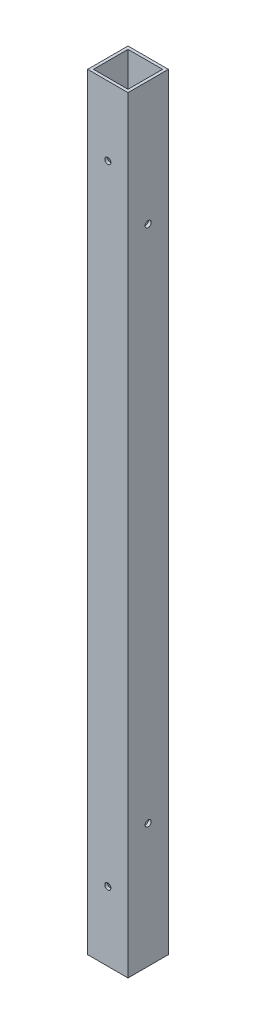
ISO-10303-21;
HEADER;
FILE_DESCRIPTION(('STEP AP214'),'2;1');
FILE_NAME('part.step','',(''),(''),'','','');
FILE_SCHEMA(('AUTOMOTIVE_DESIGN { 1 0 10303 214 1 1 1 1 }'));
ENDSEC;
DATA;
#1=APPLICATION_CONTEXT('core data for automotive mechanical design processes');
#2=APPLICATION_PROTOCOL_DEFINITION('international standard','automotive_design',2000,#1);
#3=PRODUCT_CONTEXT('',#1,'mechanical');
#4=PRODUCT('Part','Part','',(#3));
#5=PRODUCT_RELATED_PRODUCT_CATEGORY('part','',(#4));
#6=PRODUCT_DEFINITION_FORMATION('','',#4);
#7=PRODUCT_DEFINITION_CONTEXT('part definition',#1,'design');
#8=PRODUCT_DEFINITION('design','',#6,#7);
#9=PRODUCT_DEFINITION_SHAPE('','',#8);
#10=(LENGTH_UNIT() NAMED_UNIT(*) SI_UNIT(.MILLI.,.METRE.));
#11=(NAMED_UNIT(*) PLANE_ANGLE_UNIT() SI_UNIT($,.RADIAN.));
#12=(NAMED_UNIT(*) SI_UNIT($,.STERADIAN.) SOLID_ANGLE_UNIT());
#13=UNCERTAINTY_MEASURE_WITH_UNIT(LENGTH_MEASURE(1.E-05),#10,'distance_accuracy_value','');
#14=(GEOMETRIC_REPRESENTATION_CONTEXT(3) GLOBAL_UNCERTAINTY_ASSIGNED_CONTEXT((#13)) GLOBAL_UNIT_ASSIGNED_CONTEXT((#10,
#11,#12)) REPRESENTATION_CONTEXT('',''));
#15=CARTESIAN_POINT('',(0.,0.,0.));
#16=DIRECTION('',(0.,0.,1.));
#17=DIRECTION('',(1.,0.,0.));
#18=AXIS2_PLACEMENT_3D('',#15,#16,#17);
#19=CARTESIAN_POINT('',(0.,844.55,0.));
#20=DIRECTION('',(0.,-1.,0.));
#21=DIRECTION('',(0.,0.,-1.));
#22=AXIS2_PLACEMENT_3D('',#19,#20,#21);
#23=PLANE('',#22);
#24=DIRECTION('',(0.,0.,-1.));
#25=VECTOR('',#24,1.);
#26=CARTESIAN_POINT('',(22.2249999999999,844.55,22.225));
#27=LINE('',#26,#25);
#28=CARTESIAN_POINT('',(22.2249999999999,844.55,22.225));
#29=VERTEX_POINT('',#28);
#30=CARTESIAN_POINT('',(22.2249999999999,844.55,-22.225));
#31=VERTEX_POINT('',#30);
#32=EDGE_CURVE('E178',#29,#31,#27,.T.);
#33=ORIENTED_EDGE('',*,*,#32,.T.);
#34=DIRECTION('',(-1.,0.,0.));
#35=VECTOR('',#34,1.);
#36=CARTESIAN_POINT('',(-22.2249999999999,844.55,-22.225));
#37=LINE('',#36,#35);
#38=CARTESIAN_POINT('',(-22.2249999999999,844.55,-22.225));
#39=VERTEX_POINT('',#38);
#40=EDGE_CURVE('E182',#31,#39,#37,.T.);
#41=ORIENTED_EDGE('',*,*,#40,.T.);
#42=DIRECTION('',(0.,0.,1.));
#43=VECTOR('',#42,1.);
#44=CARTESIAN_POINT('',(-22.2249999999999,844.55,22.225));
#45=LINE('',#44,#43);
#46=CARTESIAN_POINT('',(-22.2249999999999,844.55,22.225));
#47=VERTEX_POINT('',#46);
#48=EDGE_CURVE('E185',#39,#47,#45,.T.);
#49=ORIENTED_EDGE('',*,*,#48,.T.);
#50=DIRECTION('',(1.,0.,0.));
#51=VECTOR('',#50,1.);
#52=CARTESIAN_POINT('',(-22.2249999999999,844.55,22.225));
#53=LINE('',#52,#51);
#54=EDGE_CURVE('E188',#47,#29,#53,.T.);
#55=ORIENTED_EDGE('',*,*,#54,.T.);
#56=EDGE_LOOP('',(#33,#41,#49,#55));
#57=FACE_BOUND('',#56,.T.);
#58=DIRECTION('',(0.,0.,-1.));
#59=VECTOR('',#58,1.);
#60=CARTESIAN_POINT('',(19.05,844.55,19.05));
#61=LINE('',#60,#59);
#62=CARTESIAN_POINT('',(19.05,844.55,19.05));
#63=VERTEX_POINT('',#62);
#64=CARTESIAN_POINT('',(19.05,844.55,-19.05));
#65=VERTEX_POINT('',#64);
#66=EDGE_CURVE('E126',#63,#65,#61,.T.);
#67=ORIENTED_EDGE('',*,*,#66,.F.);
#68=DIRECTION('',(1.,0.,0.));
#69=VECTOR('',#68,1.);
#70=CARTESIAN_POINT('',(-19.05,844.55,19.05));
#71=LINE('',#70,#69);
#72=CARTESIAN_POINT('',(-19.05,844.55,19.05));
#73=VERTEX_POINT('',#72);
#74=EDGE_CURVE('E154',#73,#63,#71,.T.);
#75=ORIENTED_EDGE('',*,*,#74,.F.);
#76=DIRECTION('',(0.,0.,1.));
#77=VECTOR('',#76,1.);
#78=CARTESIAN_POINT('',(-19.05,844.55,19.05));
#79=LINE('',#78,#77);
#80=CARTESIAN_POINT('',(-19.05,844.55,-19.05));
#81=VERTEX_POINT('',#80);
#82=EDGE_CURVE('E148',#81,#73,#79,.T.);
#83=ORIENTED_EDGE('',*,*,#82,.F.);
#84=DIRECTION('',(-1.,0.,0.));
#85=VECTOR('',#84,1.);
#86=CARTESIAN_POINT('',(-19.05,844.55,-19.05));
#87=LINE('',#86,#85);
#88=EDGE_CURVE('E135',#65,#81,#87,.T.);
#89=ORIENTED_EDGE('',*,*,#88,.F.);
#90=EDGE_LOOP('',(#67,#75,#83,#89));
#91=FACE_BOUND('',#90,.T.);
#92=ADVANCED_FACE('F42',(#57,#91),#23,.F.);
#93=CARTESIAN_POINT('',(0.,0.,0.));
#94=DIRECTION('',(0.,-1.,0.));
#95=DIRECTION('',(0.,0.,-1.));
#96=AXIS2_PLACEMENT_3D('',#93,#94,#95);
#97=PLANE('',#96);
#98=DIRECTION('',(0.,0.,-1.));
#99=VECTOR('',#98,1.);
#100=CARTESIAN_POINT('',(22.2249999999999,0.,22.225));
#101=LINE('',#100,#99);
#102=CARTESIAN_POINT('',(22.2249999999999,0.,22.225));
#103=VERTEX_POINT('',#102);
#104=CARTESIAN_POINT('',(22.2249999999999,0.,-22.225));
#105=VERTEX_POINT('',#104);
#106=EDGE_CURVE('E144',#103,#105,#101,.T.);
#107=ORIENTED_EDGE('',*,*,#106,.F.);
#108=DIRECTION('',(1.,0.,0.));
#109=VECTOR('',#108,1.);
#110=CARTESIAN_POINT('',(-22.2249999999999,0.,22.225));
#111=LINE('',#110,#109);
#112=CARTESIAN_POINT('',(-22.2249999999999,0.,22.225));
#113=VERTEX_POINT('',#112);
#114=EDGE_CURVE('E183',#113,#103,#111,.T.);
#115=ORIENTED_EDGE('',*,*,#114,.F.);
#116=DIRECTION('',(0.,0.,1.));
#117=VECTOR('',#116,1.);
#118=CARTESIAN_POINT('',(-22.2249999999999,0.,22.225));
#119=LINE('',#118,#117);
#120=CARTESIAN_POINT('',(-22.2249999999999,0.,-22.225));
#121=VERTEX_POINT('',#120);
#122=EDGE_CURVE('E198',#121,#113,#119,.T.);
#123=ORIENTED_EDGE('',*,*,#122,.F.);
#124=DIRECTION('',(-1.,0.,0.));
#125=VECTOR('',#124,1.);
#126=CARTESIAN_POINT('',(-22.2249999999999,0.,-22.225));
#127=LINE('',#126,#125);
#128=EDGE_CURVE('E195',#105,#121,#127,.T.);
#129=ORIENTED_EDGE('',*,*,#128,.F.);
#130=EDGE_LOOP('',(#107,#115,#123,#129));
#131=FACE_BOUND('',#130,.T.);
#132=DIRECTION('',(1.,0.,0.));
#133=VECTOR('',#132,1.);
#134=CARTESIAN_POINT('',(-19.05,0.,19.05));
#135=LINE('',#134,#133);
#136=CARTESIAN_POINT('',(-19.05,0.,19.05));
#137=VERTEX_POINT('',#136);
#138=CARTESIAN_POINT('',(19.05,0.,19.05));
#139=VERTEX_POINT('',#138);
#140=EDGE_CURVE('E136',#137,#139,#135,.T.);
#141=ORIENTED_EDGE('',*,*,#140,.T.);
#142=DIRECTION('',(0.,0.,-1.));
#143=VECTOR('',#142,1.);
#144=CARTESIAN_POINT('',(19.05,0.,19.05));
#145=LINE('',#144,#143);
#146=CARTESIAN_POINT('',(19.05,0.,-19.05));
#147=VERTEX_POINT('',#146);
#148=EDGE_CURVE('E74',#139,#147,#145,.T.);
#149=ORIENTED_EDGE('',*,*,#148,.T.);
#150=DIRECTION('',(-1.,0.,0.));
#151=VECTOR('',#150,1.);
#152=CARTESIAN_POINT('',(-19.05,0.,-19.05));
#153=LINE('',#152,#151);
#154=CARTESIAN_POINT('',(-19.05,0.,-19.05));
#155=VERTEX_POINT('',#154);
#156=EDGE_CURVE('E142',#147,#155,#153,.T.);
#157=ORIENTED_EDGE('',*,*,#156,.T.);
#158=DIRECTION('',(0.,0.,1.));
#159=VECTOR('',#158,1.);
#160=CARTESIAN_POINT('',(-19.05,0.,19.05));
#161=LINE('',#160,#159);
#162=EDGE_CURVE('E165',#155,#137,#161,.T.);
#163=ORIENTED_EDGE('',*,*,#162,.T.);
#164=EDGE_LOOP('',(#141,#149,#157,#163));
#165=FACE_BOUND('',#164,.T.);
#166=ADVANCED_FACE('F290',(#131,#165),#97,.T.);
#167=CARTESIAN_POINT('',(22.2249999999999,844.55,22.225));
#168=DIRECTION('',(-1.,0.,0.));
#169=DIRECTION('',(0.,0.,1.));
#170=AXIS2_PLACEMENT_3D('',#167,#168,#169);
#171=PLANE('',#170);
#172=CARTESIAN_POINT('',(22.2249999999999,136.524999999995,0.));
#173=DIRECTION('',(1.,0.,0.));
#174=DIRECTION('',(0.,0.,-1.));
#175=AXIS2_PLACEMENT_3D('',#172,#173,#174);
#176=CIRCLE('',#175,3.37343750000776);
#177=CARTESIAN_POINT('',(22.2249999999999,136.524999999995,-3.37343750000774));
#178=VERTEX_POINT('',#177);
#179=EDGE_CURVE('E237',#178,#178,#176,.T.);
#180=ORIENTED_EDGE('',*,*,#179,.F.);
#181=EDGE_LOOP('',(#180));
#182=FACE_BOUND('',#181,.T.);
#183=CARTESIAN_POINT('',(22.2249999999999,708.025000000005,0.));
#184=DIRECTION('',(1.,0.,0.));
#185=DIRECTION('',(0.,0.,-1.));
#186=AXIS2_PLACEMENT_3D('',#183,#184,#185);
#187=CIRCLE('',#186,3.37343749999222);
#188=CARTESIAN_POINT('',(22.2249999999999,708.025000000005,-3.3734374999922));
#189=VERTEX_POINT('',#188);
#190=EDGE_CURVE('E251',#189,#189,#187,.T.);
#191=ORIENTED_EDGE('',*,*,#190,.F.);
#192=EDGE_LOOP('',(#191));
#193=FACE_BOUND('',#192,.T.);
#194=ORIENTED_EDGE('',*,*,#106,.T.);
#195=DIRECTION('',(0.,-1.,0.));
#196=VECTOR('',#195,1.);
#197=CARTESIAN_POINT('',(22.2249999999999,844.55,-22.225));
#198=LINE('',#197,#196);
#199=EDGE_CURVE('E11',#31,#105,#198,.T.);
#200=ORIENTED_EDGE('',*,*,#199,.F.);
#201=ORIENTED_EDGE('',*,*,#32,.F.);
#202=DIRECTION('',(0.,-1.,0.));
#203=VECTOR('',#202,1.);
#204=CARTESIAN_POINT('',(22.2249999999999,844.55,22.225));
#205=LINE('',#204,#203);
#206=EDGE_CURVE('E191',#29,#103,#205,.T.);
#207=ORIENTED_EDGE('',*,*,#206,.T.);
#208=EDGE_LOOP('',(#194,#200,#201,#207));
#209=FACE_BOUND('',#208,.T.);
#210=ADVANCED_FACE('F44',(#182,#193,#209),#171,.F.);
#211=CARTESIAN_POINT('',(-22.2249999999999,844.55,-22.225));
#212=DIRECTION('',(0.,0.,1.));
#213=DIRECTION('',(1.,0.,0.));
#214=AXIS2_PLACEMENT_3D('',#211,#212,#213);
#215=PLANE('',#214);
#216=CARTESIAN_POINT('',(0.,768.35,-22.225));
#217=DIRECTION('',(0.,0.,1.));
#218=DIRECTION('',(1.,0.,0.));
#219=AXIS2_PLACEMENT_3D('',#216,#217,#218);
#220=CIRCLE('',#219,3.37350099999999);
#221=CARTESIAN_POINT('',(3.37350099999999,768.35,-22.225));
#222=VERTEX_POINT('',#221);
#223=EDGE_CURVE('E222',#222,#222,#220,.T.);
#224=ORIENTED_EDGE('',*,*,#223,.T.);
#225=EDGE_LOOP('',(#224));
#226=FACE_BOUND('',#225,.T.);
#227=CARTESIAN_POINT('',(0.,76.2,-22.225));
#228=DIRECTION('',(0.,0.,1.));
#229=DIRECTION('',(1.,0.,0.));
#230=AXIS2_PLACEMENT_3D('',#227,#228,#229);
#231=CIRCLE('',#230,3.37350099999999);
#232=CARTESIAN_POINT('',(3.37350099999999,76.2,-22.225));
#233=VERTEX_POINT('',#232);
#234=EDGE_CURVE('E217',#233,#233,#231,.T.);
#235=ORIENTED_EDGE('',*,*,#234,.T.);
#236=EDGE_LOOP('',(#235));
#237=FACE_BOUND('',#236,.T.);
#238=ORIENTED_EDGE('',*,*,#128,.T.);
#239=DIRECTION('',(0.,-1.,0.));
#240=VECTOR('',#239,1.);
#241=CARTESIAN_POINT('',(-22.2249999999999,844.55,-22.225));
#242=LINE('',#241,#240);
#243=EDGE_CURVE('E52',#39,#121,#242,.T.);
#244=ORIENTED_EDGE('',*,*,#243,.F.);
#245=ORIENTED_EDGE('',*,*,#40,.F.);
#246=ORIENTED_EDGE('',*,*,#199,.T.);
#247=EDGE_LOOP('',(#238,#244,#245,#246));
#248=FACE_BOUND('',#247,.T.);
#249=ADVANCED_FACE('F318',(#226,#237,#248),#215,.F.);
#250=CARTESIAN_POINT('',(-22.2249999999999,844.55,22.225));
#251=DIRECTION('',(1.,0.,0.));
#252=DIRECTION('',(0.,0.,-1.));
#253=AXIS2_PLACEMENT_3D('',#250,#251,#252);
#254=PLANE('',#253);
#255=CARTESIAN_POINT('',(-22.2249999999999,136.524999999995,0.));
#256=DIRECTION('',(1.,0.,0.));
#257=DIRECTION('',(0.,0.,-1.));
#258=AXIS2_PLACEMENT_3D('',#255,#256,#257);
#259=CIRCLE('',#258,3.37343750000776);
#260=CARTESIAN_POINT('',(-22.2249999999999,136.524999999995,-3.37343750000774));
#261=VERTEX_POINT('',#260);
#262=EDGE_CURVE('E227',#261,#261,#259,.T.);
#263=ORIENTED_EDGE('',*,*,#262,.T.);
#264=EDGE_LOOP('',(#263));
#265=FACE_BOUND('',#264,.T.);
#266=CARTESIAN_POINT('',(-22.2249999999999,708.025000000005,0.));
#267=DIRECTION('',(1.,0.,0.));
#268=DIRECTION('',(0.,0.,-1.));
#269=AXIS2_PLACEMENT_3D('',#266,#267,#268);
#270=CIRCLE('',#269,3.37343749999222);
#271=CARTESIAN_POINT('',(-22.2249999999999,708.025000000005,-3.3734374999922));
#272=VERTEX_POINT('',#271);
#273=EDGE_CURVE('E246',#272,#272,#270,.T.);
#274=ORIENTED_EDGE('',*,*,#273,.T.);
#275=EDGE_LOOP('',(#274));
#276=FACE_BOUND('',#275,.T.);
#277=ORIENTED_EDGE('',*,*,#122,.T.);
#278=DIRECTION('',(0.,-1.,0.));
#279=VECTOR('',#278,1.);
#280=CARTESIAN_POINT('',(-22.2249999999999,844.55,22.225));
#281=LINE('',#280,#279);
#282=EDGE_CURVE('E206',#47,#113,#281,.T.);
#283=ORIENTED_EDGE('',*,*,#282,.F.);
#284=ORIENTED_EDGE('',*,*,#48,.F.);
#285=ORIENTED_EDGE('',*,*,#243,.T.);
#286=EDGE_LOOP('',(#277,#283,#284,#285));
#287=FACE_BOUND('',#286,.T.);
#288=ADVANCED_FACE('F315',(#265,#276,#287),#254,.F.);
#289=CARTESIAN_POINT('',(-22.2249999999999,844.55,22.225));
#290=DIRECTION('',(0.,0.,-1.));
#291=DIRECTION('',(-1.,0.,0.));
#292=AXIS2_PLACEMENT_3D('',#289,#290,#291);
#293=PLANE('',#292);
#294=CARTESIAN_POINT('',(0.,768.35,22.225));
#295=DIRECTION('',(0.,0.,1.));
#296=DIRECTION('',(1.,0.,0.));
#297=AXIS2_PLACEMENT_3D('',#294,#295,#296);
#298=CIRCLE('',#297,3.37350099999999);
#299=CARTESIAN_POINT('',(3.37350099999999,768.35,22.225));
#300=VERTEX_POINT('',#299);
#301=EDGE_CURVE('E259',#300,#300,#298,.T.);
#302=ORIENTED_EDGE('',*,*,#301,.F.);
#303=EDGE_LOOP('',(#302));
#304=FACE_BOUND('',#303,.T.);
#305=CARTESIAN_POINT('',(0.,76.2,22.225));
#306=DIRECTION('',(0.,0.,1.));
#307=DIRECTION('',(1.,0.,0.));
#308=AXIS2_PLACEMENT_3D('',#305,#306,#307);
#309=CIRCLE('',#308,3.37350099999999);
#310=CARTESIAN_POINT('',(3.37350099999999,76.2,22.225));
#311=VERTEX_POINT('',#310);
#312=EDGE_CURVE('E269',#311,#311,#309,.T.);
#313=ORIENTED_EDGE('',*,*,#312,.F.);
#314=EDGE_LOOP('',(#313));
#315=FACE_BOUND('',#314,.T.);
#316=ORIENTED_EDGE('',*,*,#114,.T.);
#317=ORIENTED_EDGE('',*,*,#206,.F.);
#318=ORIENTED_EDGE('',*,*,#54,.F.);
#319=ORIENTED_EDGE('',*,*,#282,.T.);
#320=EDGE_LOOP('',(#316,#317,#318,#319));
#321=FACE_BOUND('',#320,.T.);
#322=ADVANCED_FACE('F312',(#304,#315,#321),#293,.F.);
#323=CARTESIAN_POINT('',(19.05,844.55,19.05));
#324=DIRECTION('',(-1.,0.,0.));
#325=DIRECTION('',(0.,0.,1.));
#326=AXIS2_PLACEMENT_3D('',#323,#324,#325);
#327=PLANE('',#326);
#328=CARTESIAN_POINT('',(19.05,136.524999999995,0.));
#329=DIRECTION('',(-1.,0.,0.));
#330=DIRECTION('',(0.,0.,1.));
#331=AXIS2_PLACEMENT_3D('',#328,#329,#330);
#332=CIRCLE('',#331,3.37343750000776);
#333=CARTESIAN_POINT('',(19.05,136.524999999995,3.37343750000778));
#334=VERTEX_POINT('',#333);
#335=EDGE_CURVE('E255',#334,#334,#332,.T.);
#336=ORIENTED_EDGE('',*,*,#335,.F.);
#337=EDGE_LOOP('',(#336));
#338=FACE_BOUND('',#337,.T.);
#339=CARTESIAN_POINT('',(19.05,708.025000000005,0.));
#340=DIRECTION('',(-1.,0.,0.));
#341=DIRECTION('',(0.,0.,1.));
#342=AXIS2_PLACEMENT_3D('',#339,#340,#341);
#343=CIRCLE('',#342,3.37343749999222);
#344=CARTESIAN_POINT('',(19.05,708.025000000005,3.37343749999224));
#345=VERTEX_POINT('',#344);
#346=EDGE_CURVE('E226',#345,#345,#343,.T.);
#347=ORIENTED_EDGE('',*,*,#346,.F.);
#348=EDGE_LOOP('',(#347));
#349=FACE_BOUND('',#348,.T.);
#350=ORIENTED_EDGE('',*,*,#148,.F.);
#351=DIRECTION('',(0.,-1.,0.));
#352=VECTOR('',#351,1.);
#353=CARTESIAN_POINT('',(19.05,844.55,19.05));
#354=LINE('',#353,#352);
#355=EDGE_CURVE('E130',#63,#139,#354,.T.);
#356=ORIENTED_EDGE('',*,*,#355,.F.);
#357=ORIENTED_EDGE('',*,*,#66,.T.);
#358=DIRECTION('',(0.,-1.,0.));
#359=VECTOR('',#358,1.);
#360=CARTESIAN_POINT('',(19.05,844.55,-19.05));
#361=LINE('',#360,#359);
#362=EDGE_CURVE('E129',#65,#147,#361,.T.);
#363=ORIENTED_EDGE('',*,*,#362,.T.);
#364=EDGE_LOOP('',(#350,#356,#357,#363));
#365=FACE_BOUND('',#364,.T.);
#366=ADVANCED_FACE('F128',(#338,#349,#365),#327,.T.);
#367=CARTESIAN_POINT('',(-19.05,844.55,-19.05));
#368=DIRECTION('',(0.,0.,1.));
#369=DIRECTION('',(1.,0.,0.));
#370=AXIS2_PLACEMENT_3D('',#367,#368,#369);
#371=PLANE('',#370);
#372=CARTESIAN_POINT('',(0.,768.35,-19.05));
#373=DIRECTION('',(0.,0.,1.));
#374=DIRECTION('',(1.,0.,0.));
#375=AXIS2_PLACEMENT_3D('',#372,#373,#374);
#376=CIRCLE('',#375,3.37350099999999);
#377=CARTESIAN_POINT('',(3.37350099999999,768.35,-19.05));
#378=VERTEX_POINT('',#377);
#379=EDGE_CURVE('E218',#378,#378,#376,.T.);
#380=ORIENTED_EDGE('',*,*,#379,.F.);
#381=EDGE_LOOP('',(#380));
#382=FACE_BOUND('',#381,.T.);
#383=CARTESIAN_POINT('',(0.,76.2,-19.05));
#384=DIRECTION('',(0.,0.,1.));
#385=DIRECTION('',(1.,0.,0.));
#386=AXIS2_PLACEMENT_3D('',#383,#384,#385);
#387=CIRCLE('',#386,3.37350099999999);
#388=CARTESIAN_POINT('',(3.37350099999999,76.2,-19.05));
#389=VERTEX_POINT('',#388);
#390=EDGE_CURVE('E213',#389,#389,#387,.T.);
#391=ORIENTED_EDGE('',*,*,#390,.F.);
#392=EDGE_LOOP('',(#391));
#393=FACE_BOUND('',#392,.T.);
#394=ORIENTED_EDGE('',*,*,#156,.F.);
#395=ORIENTED_EDGE('',*,*,#362,.F.);
#396=ORIENTED_EDGE('',*,*,#88,.T.);
#397=DIRECTION('',(0.,-1.,0.));
#398=VECTOR('',#397,1.);
#399=CARTESIAN_POINT('',(-19.05,844.55,-19.05));
#400=LINE('',#399,#398);
#401=EDGE_CURVE('E145',#81,#155,#400,.T.);
#402=ORIENTED_EDGE('',*,*,#401,.T.);
#403=EDGE_LOOP('',(#394,#395,#396,#402));
#404=FACE_BOUND('',#403,.T.);
#405=ADVANCED_FACE('F139',(#382,#393,#404),#371,.T.);
#406=CARTESIAN_POINT('',(-19.05,844.55,19.05));
#407=DIRECTION('',(1.,0.,0.));
#408=DIRECTION('',(0.,0.,-1.));
#409=AXIS2_PLACEMENT_3D('',#406,#407,#408);
#410=PLANE('',#409);
#411=CARTESIAN_POINT('',(-19.05,136.524999999995,0.));
#412=DIRECTION('',(1.,0.,0.));
#413=DIRECTION('',(0.,0.,-1.));
#414=AXIS2_PLACEMENT_3D('',#411,#412,#413);
#415=CIRCLE('',#414,3.37343750000776);
#416=CARTESIAN_POINT('',(-19.05,136.524999999995,-3.37343750000774));
#417=VERTEX_POINT('',#416);
#418=EDGE_CURVE('E46',#417,#417,#415,.T.);
#419=ORIENTED_EDGE('',*,*,#418,.F.);
#420=EDGE_LOOP('',(#419));
#421=FACE_BOUND('',#420,.T.);
#422=CARTESIAN_POINT('',(-19.05,708.025000000005,0.));
#423=DIRECTION('',(1.,0.,0.));
#424=DIRECTION('',(0.,0.,-1.));
#425=AXIS2_PLACEMENT_3D('',#422,#423,#424);
#426=CIRCLE('',#425,3.37343749999222);
#427=CARTESIAN_POINT('',(-19.05,708.025000000005,-3.3734374999922));
#428=VERTEX_POINT('',#427);
#429=EDGE_CURVE('E223',#428,#428,#426,.T.);
#430=ORIENTED_EDGE('',*,*,#429,.F.);
#431=EDGE_LOOP('',(#430));
#432=FACE_BOUND('',#431,.T.);
#433=ORIENTED_EDGE('',*,*,#162,.F.);
#434=ORIENTED_EDGE('',*,*,#401,.F.);
#435=ORIENTED_EDGE('',*,*,#82,.T.);
#436=DIRECTION('',(0.,-1.,0.));
#437=VECTOR('',#436,1.);
#438=CARTESIAN_POINT('',(-19.05,844.55,19.05));
#439=LINE('',#438,#437);
#440=EDGE_CURVE('E63',#73,#137,#439,.T.);
#441=ORIENTED_EDGE('',*,*,#440,.T.);
#442=EDGE_LOOP('',(#433,#434,#435,#441));
#443=FACE_BOUND('',#442,.T.);
#444=ADVANCED_FACE('F285',(#421,#432,#443),#410,.T.);
#445=CARTESIAN_POINT('',(-19.05,844.55,19.05));
#446=DIRECTION('',(0.,0.,-1.));
#447=DIRECTION('',(-1.,0.,0.));
#448=AXIS2_PLACEMENT_3D('',#445,#446,#447);
#449=PLANE('',#448);
#450=CARTESIAN_POINT('',(0.,768.35,19.05));
#451=DIRECTION('',(0.,0.,-1.));
#452=DIRECTION('',(-1.,0.,0.));
#453=AXIS2_PLACEMENT_3D('',#450,#451,#452);
#454=CIRCLE('',#453,3.37350099999999);
#455=CARTESIAN_POINT('',(-3.37350099999999,768.35,19.05));
#456=VERTEX_POINT('',#455);
#457=EDGE_CURVE('E221',#456,#456,#454,.T.);
#458=ORIENTED_EDGE('',*,*,#457,.F.);
#459=EDGE_LOOP('',(#458));
#460=FACE_BOUND('',#459,.T.);
#461=CARTESIAN_POINT('',(0.,76.2,19.05));
#462=DIRECTION('',(0.,0.,-1.));
#463=DIRECTION('',(-1.,0.,0.));
#464=AXIS2_PLACEMENT_3D('',#461,#462,#463);
#465=CIRCLE('',#464,3.37350099999999);
#466=CARTESIAN_POINT('',(-3.37350099999999,76.2,19.05));
#467=VERTEX_POINT('',#466);
#468=EDGE_CURVE('E162',#467,#467,#465,.T.);
#469=ORIENTED_EDGE('',*,*,#468,.F.);
#470=EDGE_LOOP('',(#469));
#471=FACE_BOUND('',#470,.T.);
#472=ORIENTED_EDGE('',*,*,#140,.F.);
#473=ORIENTED_EDGE('',*,*,#440,.F.);
#474=ORIENTED_EDGE('',*,*,#74,.T.);
#475=ORIENTED_EDGE('',*,*,#355,.T.);
#476=EDGE_LOOP('',(#472,#473,#474,#475));
#477=FACE_BOUND('',#476,.T.);
#478=ADVANCED_FACE('F282',(#460,#471,#477),#449,.T.);
#479=CARTESIAN_POINT('',(0.,76.2,22.225));
#480=DIRECTION('',(0.,0.,1.));
#481=DIRECTION('',(1.,0.,0.));
#482=AXIS2_PLACEMENT_3D('',#479,#480,#481);
#483=CYLINDRICAL_SURFACE('',#482,3.37350099999999);
#484=ORIENTED_EDGE('',*,*,#390,.T.);
#485=EDGE_LOOP('',(#484));
#486=FACE_BOUND('',#485,.T.);
#487=ORIENTED_EDGE('',*,*,#234,.F.);
#488=EDGE_LOOP('',(#487));
#489=FACE_BOUND('',#488,.T.);
#490=ADVANCED_FACE('F284',(#486,#489),#483,.F.);
#491=ORIENTED_EDGE('',*,*,#468,.T.);
#492=EDGE_LOOP('',(#491));
#493=FACE_BOUND('',#492,.T.);
#494=ORIENTED_EDGE('',*,*,#312,.T.);
#495=EDGE_LOOP('',(#494));
#496=FACE_BOUND('',#495,.T.);
#497=ADVANCED_FACE('F279',(#493,#496),#483,.F.);
#498=CARTESIAN_POINT('',(0.,768.35,22.225));
#499=DIRECTION('',(0.,0.,1.));
#500=DIRECTION('',(1.,0.,0.));
#501=AXIS2_PLACEMENT_3D('',#498,#499,#500);
#502=CYLINDRICAL_SURFACE('',#501,3.37350099999999);
#503=ORIENTED_EDGE('',*,*,#379,.T.);
#504=EDGE_LOOP('',(#503));
#505=FACE_BOUND('',#504,.T.);
#506=ORIENTED_EDGE('',*,*,#223,.F.);
#507=EDGE_LOOP('',(#506));
#508=FACE_BOUND('',#507,.T.);
#509=ADVANCED_FACE('F349',(#505,#508),#502,.F.);
#510=ORIENTED_EDGE('',*,*,#457,.T.);
#511=EDGE_LOOP('',(#510));
#512=FACE_BOUND('',#511,.T.);
#513=ORIENTED_EDGE('',*,*,#301,.T.);
#514=EDGE_LOOP('',(#513));
#515=FACE_BOUND('',#514,.T.);
#516=ADVANCED_FACE('F353',(#512,#515),#502,.F.);
#517=CARTESIAN_POINT('',(-22.2249999999999,708.025000000005,0.));
#518=DIRECTION('',(1.,0.,0.));
#519=DIRECTION('',(0.,0.,-1.));
#520=AXIS2_PLACEMENT_3D('',#517,#518,#519);
#521=CYLINDRICAL_SURFACE('',#520,3.37343749999222);
#522=ORIENTED_EDGE('',*,*,#429,.T.);
#523=EDGE_LOOP('',(#522));
#524=FACE_BOUND('',#523,.T.);
#525=ORIENTED_EDGE('',*,*,#273,.F.);
#526=EDGE_LOOP('',(#525));
#527=FACE_BOUND('',#526,.T.);
#528=ADVANCED_FACE('F355',(#524,#527),#521,.F.);
#529=CARTESIAN_POINT('',(-22.2249999999999,136.524999999995,0.));
#530=DIRECTION('',(1.,0.,0.));
#531=DIRECTION('',(0.,0.,-1.));
#532=AXIS2_PLACEMENT_3D('',#529,#530,#531);
#533=CYLINDRICAL_SURFACE('',#532,3.37343750000776);
#534=ORIENTED_EDGE('',*,*,#418,.T.);
#535=EDGE_LOOP('',(#534));
#536=FACE_BOUND('',#535,.T.);
#537=ORIENTED_EDGE('',*,*,#262,.F.);
#538=EDGE_LOOP('',(#537));
#539=FACE_BOUND('',#538,.T.);
#540=ADVANCED_FACE('F358',(#536,#539),#533,.F.);
#541=ORIENTED_EDGE('',*,*,#346,.T.);
#542=EDGE_LOOP('',(#541));
#543=FACE_BOUND('',#542,.T.);
#544=ORIENTED_EDGE('',*,*,#190,.T.);
#545=EDGE_LOOP('',(#544));
#546=FACE_BOUND('',#545,.T.);
#547=ADVANCED_FACE('F359',(#543,#546),#521,.F.);
#548=ORIENTED_EDGE('',*,*,#335,.T.);
#549=EDGE_LOOP('',(#548));
#550=FACE_BOUND('',#549,.T.);
#551=ORIENTED_EDGE('',*,*,#179,.T.);
#552=EDGE_LOOP('',(#551));
#553=FACE_BOUND('',#552,.T.);
#554=ADVANCED_FACE('F362',(#550,#553),#533,.F.);
#555=CLOSED_SHELL('',(#92,#166,#210,#249,#288,#322,#366,#405,#444,#478,#490,#497,#509,#516,#528,
#540,#547,#554));
#556=MANIFOLD_SOLID_BREP('B2',#555);
#557=ADVANCED_BREP_SHAPE_REPRESENTATION('',(#18,#556),#14);
#558=SHAPE_DEFINITION_REPRESENTATION(#9,#557);
ENDSEC;
END-ISO-10303-21;
